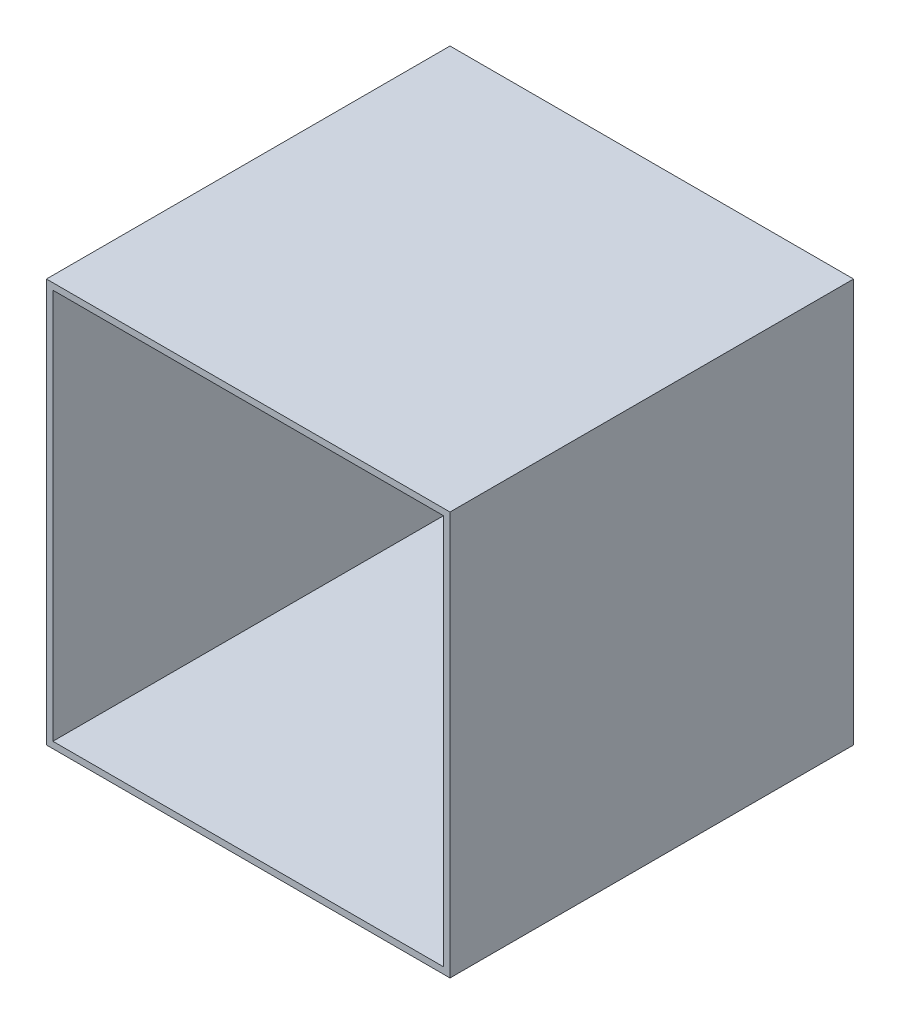
ISO-10303-21;
HEADER;
FILE_DESCRIPTION(('STEP AP214'),'2;1');
FILE_NAME('part.step','',(''),(''),'','','');
FILE_SCHEMA(('AUTOMOTIVE_DESIGN { 1 0 10303 214 1 1 1 1 }'));
ENDSEC;
DATA;
#1=APPLICATION_CONTEXT('core data for automotive mechanical design processes');
#2=APPLICATION_PROTOCOL_DEFINITION('international standard','automotive_design',2000,#1);
#3=PRODUCT_CONTEXT('',#1,'mechanical');
#4=PRODUCT('Part','Part','',(#3));
#5=PRODUCT_RELATED_PRODUCT_CATEGORY('part','',(#4));
#6=PRODUCT_DEFINITION_FORMATION('','',#4);
#7=PRODUCT_DEFINITION_CONTEXT('part definition',#1,'design');
#8=PRODUCT_DEFINITION('design','',#6,#7);
#9=PRODUCT_DEFINITION_SHAPE('','',#8);
#10=(LENGTH_UNIT() NAMED_UNIT(*) SI_UNIT(.MILLI.,.METRE.));
#11=(NAMED_UNIT(*) PLANE_ANGLE_UNIT() SI_UNIT($,.RADIAN.));
#12=(NAMED_UNIT(*) SI_UNIT($,.STERADIAN.) SOLID_ANGLE_UNIT());
#13=UNCERTAINTY_MEASURE_WITH_UNIT(LENGTH_MEASURE(1.E-05),#10,'distance_accuracy_value','');
#14=(GEOMETRIC_REPRESENTATION_CONTEXT(3) GLOBAL_UNCERTAINTY_ASSIGNED_CONTEXT((#13)) GLOBAL_UNIT_ASSIGNED_CONTEXT((#10,
#11,#12)) REPRESENTATION_CONTEXT('',''));
#15=CARTESIAN_POINT('',(0.,0.,0.));
#16=DIRECTION('',(0.,0.,1.));
#17=DIRECTION('',(1.,0.,0.));
#18=AXIS2_PLACEMENT_3D('',#15,#16,#17);
#19=CARTESIAN_POINT('',(0.,0.,25.));
#20=DIRECTION('',(0.,0.,1.));
#21=DIRECTION('',(1.,0.,0.));
#22=AXIS2_PLACEMENT_3D('',#19,#20,#21);
#23=PLANE('',#22);
#24=DIRECTION('',(0.,1.,0.));
#25=VECTOR('',#24,1.);
#26=CARTESIAN_POINT('',(12.5,12.5,25.));
#27=LINE('',#26,#25);
#28=CARTESIAN_POINT('',(12.5,-12.5,25.));
#29=VERTEX_POINT('',#28);
#30=CARTESIAN_POINT('',(12.5,12.5,25.));
#31=VERTEX_POINT('',#30);
#32=EDGE_CURVE('E134',#29,#31,#27,.T.);
#33=ORIENTED_EDGE('',*,*,#32,.T.);
#34=DIRECTION('',(-1.,0.,0.));
#35=VECTOR('',#34,1.);
#36=CARTESIAN_POINT('',(-12.5,12.5,25.));
#37=LINE('',#36,#35);
#38=CARTESIAN_POINT('',(-12.5,12.5,25.));
#39=VERTEX_POINT('',#38);
#40=EDGE_CURVE('E137',#31,#39,#37,.T.);
#41=ORIENTED_EDGE('',*,*,#40,.T.);
#42=DIRECTION('',(0.,-1.,0.));
#43=VECTOR('',#42,1.);
#44=CARTESIAN_POINT('',(-12.5,12.5,25.));
#45=LINE('',#44,#43);
#46=CARTESIAN_POINT('',(-12.5,-12.5,25.));
#47=VERTEX_POINT('',#46);
#48=EDGE_CURVE('E140',#39,#47,#45,.T.);
#49=ORIENTED_EDGE('',*,*,#48,.T.);
#50=DIRECTION('',(1.,0.,0.));
#51=VECTOR('',#50,1.);
#52=CARTESIAN_POINT('',(-12.5,-12.5,25.));
#53=LINE('',#52,#51);
#54=EDGE_CURVE('E142',#47,#29,#53,.T.);
#55=ORIENTED_EDGE('',*,*,#54,.T.);
#56=EDGE_LOOP('',(#33,#41,#49,#55));
#57=FACE_BOUND('',#56,.T.);
#58=DIRECTION('',(-1.,0.,0.));
#59=VECTOR('',#58,1.);
#60=CARTESIAN_POINT('',(-12.1,12.1,25.));
#61=LINE('',#60,#59);
#62=CARTESIAN_POINT('',(12.1,12.1,25.));
#63=VERTEX_POINT('',#62);
#64=CARTESIAN_POINT('',(-12.1,12.1,25.));
#65=VERTEX_POINT('',#64);
#66=EDGE_CURVE('E106',#63,#65,#61,.T.);
#67=ORIENTED_EDGE('',*,*,#66,.F.);
#68=DIRECTION('',(0.,1.,0.));
#69=VECTOR('',#68,1.);
#70=CARTESIAN_POINT('',(12.1,12.1,25.));
#71=LINE('',#70,#69);
#72=CARTESIAN_POINT('',(12.1,-12.1,25.));
#73=VERTEX_POINT('',#72);
#74=EDGE_CURVE('E98',#73,#63,#71,.T.);
#75=ORIENTED_EDGE('',*,*,#74,.F.);
#76=DIRECTION('',(1.,0.,0.));
#77=VECTOR('',#76,1.);
#78=CARTESIAN_POINT('',(-12.1,-12.1,25.));
#79=LINE('',#78,#77);
#80=CARTESIAN_POINT('',(-12.1,-12.1,25.));
#81=VERTEX_POINT('',#80);
#82=EDGE_CURVE('E120',#81,#73,#79,.T.);
#83=ORIENTED_EDGE('',*,*,#82,.F.);
#84=DIRECTION('',(0.,-1.,0.));
#85=VECTOR('',#84,1.);
#86=CARTESIAN_POINT('',(-12.1,12.1,25.));
#87=LINE('',#86,#85);
#88=EDGE_CURVE('E118',#65,#81,#87,.T.);
#89=ORIENTED_EDGE('',*,*,#88,.F.);
#90=EDGE_LOOP('',(#67,#75,#83,#89));
#91=FACE_BOUND('',#90,.T.);
#92=ADVANCED_FACE('F33',(#57,#91),#23,.T.);
#93=CARTESIAN_POINT('',(0.,0.,0.));
#94=DIRECTION('',(0.,0.,1.));
#95=DIRECTION('',(1.,0.,0.));
#96=AXIS2_PLACEMENT_3D('',#93,#94,#95);
#97=PLANE('',#96);
#98=DIRECTION('',(0.,1.,0.));
#99=VECTOR('',#98,1.);
#100=CARTESIAN_POINT('',(12.5,12.5,0.));
#101=LINE('',#100,#99);
#102=CARTESIAN_POINT('',(12.5,-12.5,0.));
#103=VERTEX_POINT('',#102);
#104=CARTESIAN_POINT('',(12.5,12.5,0.));
#105=VERTEX_POINT('',#104);
#106=EDGE_CURVE('E114',#103,#105,#101,.T.);
#107=ORIENTED_EDGE('',*,*,#106,.F.);
#108=DIRECTION('',(1.,0.,0.));
#109=VECTOR('',#108,1.);
#110=CARTESIAN_POINT('',(-12.5,-12.5,0.));
#111=LINE('',#110,#109);
#112=CARTESIAN_POINT('',(-12.5,-12.5,0.));
#113=VERTEX_POINT('',#112);
#114=EDGE_CURVE('E138',#113,#103,#111,.T.);
#115=ORIENTED_EDGE('',*,*,#114,.F.);
#116=DIRECTION('',(0.,-1.,0.));
#117=VECTOR('',#116,1.);
#118=CARTESIAN_POINT('',(-12.5,12.5,0.));
#119=LINE('',#118,#117);
#120=CARTESIAN_POINT('',(-12.5,12.5,0.));
#121=VERTEX_POINT('',#120);
#122=EDGE_CURVE('E149',#121,#113,#119,.T.);
#123=ORIENTED_EDGE('',*,*,#122,.F.);
#124=DIRECTION('',(-1.,0.,0.));
#125=VECTOR('',#124,1.);
#126=CARTESIAN_POINT('',(-12.5,12.5,0.));
#127=LINE('',#126,#125);
#128=EDGE_CURVE('E147',#105,#121,#127,.T.);
#129=ORIENTED_EDGE('',*,*,#128,.F.);
#130=EDGE_LOOP('',(#107,#115,#123,#129));
#131=FACE_BOUND('',#130,.T.);
#132=DIRECTION('',(0.,1.,0.));
#133=VECTOR('',#132,1.);
#134=CARTESIAN_POINT('',(12.1,12.1,0.));
#135=LINE('',#134,#133);
#136=CARTESIAN_POINT('',(12.1,-12.1,0.));
#137=VERTEX_POINT('',#136);
#138=CARTESIAN_POINT('',(12.1,12.1,0.));
#139=VERTEX_POINT('',#138);
#140=EDGE_CURVE('E56',#137,#139,#135,.T.);
#141=ORIENTED_EDGE('',*,*,#140,.T.);
#142=DIRECTION('',(-1.,0.,0.));
#143=VECTOR('',#142,1.);
#144=CARTESIAN_POINT('',(-12.1,12.1,0.));
#145=LINE('',#144,#143);
#146=CARTESIAN_POINT('',(-12.1,12.1,0.));
#147=VERTEX_POINT('',#146);
#148=EDGE_CURVE('E113',#139,#147,#145,.T.);
#149=ORIENTED_EDGE('',*,*,#148,.T.);
#150=DIRECTION('',(0.,-1.,0.));
#151=VECTOR('',#150,1.);
#152=CARTESIAN_POINT('',(-12.1,12.1,0.));
#153=LINE('',#152,#151);
#154=CARTESIAN_POINT('',(-12.1,-12.1,0.));
#155=VERTEX_POINT('',#154);
#156=EDGE_CURVE('E126',#147,#155,#153,.T.);
#157=ORIENTED_EDGE('',*,*,#156,.T.);
#158=DIRECTION('',(1.,0.,0.));
#159=VECTOR('',#158,1.);
#160=CARTESIAN_POINT('',(-12.1,-12.1,0.));
#161=LINE('',#160,#159);
#162=EDGE_CURVE('E107',#155,#137,#161,.T.);
#163=ORIENTED_EDGE('',*,*,#162,.T.);
#164=EDGE_LOOP('',(#141,#149,#157,#163));
#165=FACE_BOUND('',#164,.T.);
#166=ADVANCED_FACE('F167',(#131,#165),#97,.F.);
#167=CARTESIAN_POINT('',(12.5,12.5,25.));
#168=DIRECTION('',(-1.,0.,0.));
#169=DIRECTION('',(0.,-1.,0.));
#170=AXIS2_PLACEMENT_3D('',#167,#168,#169);
#171=PLANE('',#170);
#172=ORIENTED_EDGE('',*,*,#106,.T.);
#173=DIRECTION('',(0.,0.,-1.));
#174=VECTOR('',#173,1.);
#175=CARTESIAN_POINT('',(12.5,12.5,25.));
#176=LINE('',#175,#174);
#177=EDGE_CURVE('E11',#31,#105,#176,.T.);
#178=ORIENTED_EDGE('',*,*,#177,.F.);
#179=ORIENTED_EDGE('',*,*,#32,.F.);
#180=DIRECTION('',(0.,0.,-1.));
#181=VECTOR('',#180,1.);
#182=CARTESIAN_POINT('',(12.5,-12.5,25.));
#183=LINE('',#182,#181);
#184=EDGE_CURVE('E144',#29,#103,#183,.T.);
#185=ORIENTED_EDGE('',*,*,#184,.T.);
#186=EDGE_LOOP('',(#172,#178,#179,#185));
#187=FACE_BOUND('',#186,.T.);
#188=ADVANCED_FACE('F35',(#187),#171,.F.);
#189=CARTESIAN_POINT('',(-12.5,12.5,25.));
#190=DIRECTION('',(0.,-1.,0.));
#191=DIRECTION('',(0.,0.,-1.));
#192=AXIS2_PLACEMENT_3D('',#189,#190,#191);
#193=PLANE('',#192);
#194=ORIENTED_EDGE('',*,*,#128,.T.);
#195=DIRECTION('',(0.,0.,-1.));
#196=VECTOR('',#195,1.);
#197=CARTESIAN_POINT('',(-12.5,12.5,25.));
#198=LINE('',#197,#196);
#199=EDGE_CURVE('E41',#39,#121,#198,.T.);
#200=ORIENTED_EDGE('',*,*,#199,.F.);
#201=ORIENTED_EDGE('',*,*,#40,.F.);
#202=ORIENTED_EDGE('',*,*,#177,.T.);
#203=EDGE_LOOP('',(#194,#200,#201,#202));
#204=FACE_BOUND('',#203,.T.);
#205=ADVANCED_FACE('F177',(#204),#193,.F.);
#206=CARTESIAN_POINT('',(-12.5,12.5,25.));
#207=DIRECTION('',(1.,0.,0.));
#208=DIRECTION('',(0.,1.,0.));
#209=AXIS2_PLACEMENT_3D('',#206,#207,#208);
#210=PLANE('',#209);
#211=ORIENTED_EDGE('',*,*,#122,.T.);
#212=DIRECTION('',(0.,0.,-1.));
#213=VECTOR('',#212,1.);
#214=CARTESIAN_POINT('',(-12.5,-12.5,25.));
#215=LINE('',#214,#213);
#216=EDGE_CURVE('E154',#47,#113,#215,.T.);
#217=ORIENTED_EDGE('',*,*,#216,.F.);
#218=ORIENTED_EDGE('',*,*,#48,.F.);
#219=ORIENTED_EDGE('',*,*,#199,.T.);
#220=EDGE_LOOP('',(#211,#217,#218,#219));
#221=FACE_BOUND('',#220,.T.);
#222=ADVANCED_FACE('F161',(#221),#210,.F.);
#223=CARTESIAN_POINT('',(-12.5,-12.5,25.));
#224=DIRECTION('',(0.,1.,0.));
#225=DIRECTION('',(0.,0.,1.));
#226=AXIS2_PLACEMENT_3D('',#223,#224,#225);
#227=PLANE('',#226);
#228=ORIENTED_EDGE('',*,*,#114,.T.);
#229=ORIENTED_EDGE('',*,*,#184,.F.);
#230=ORIENTED_EDGE('',*,*,#54,.F.);
#231=ORIENTED_EDGE('',*,*,#216,.T.);
#232=EDGE_LOOP('',(#228,#229,#230,#231));
#233=FACE_BOUND('',#232,.T.);
#234=ADVANCED_FACE('F171',(#233),#227,.F.);
#235=CARTESIAN_POINT('',(12.1,12.1,25.));
#236=DIRECTION('',(-1.,0.,0.));
#237=DIRECTION('',(0.,-1.,0.));
#238=AXIS2_PLACEMENT_3D('',#235,#236,#237);
#239=PLANE('',#238);
#240=ORIENTED_EDGE('',*,*,#140,.F.);
#241=DIRECTION('',(0.,0.,-1.));
#242=VECTOR('',#241,1.);
#243=CARTESIAN_POINT('',(12.1,-12.1,25.));
#244=LINE('',#243,#242);
#245=EDGE_CURVE('E102',#73,#137,#244,.T.);
#246=ORIENTED_EDGE('',*,*,#245,.F.);
#247=ORIENTED_EDGE('',*,*,#74,.T.);
#248=DIRECTION('',(0.,0.,-1.));
#249=VECTOR('',#248,1.);
#250=CARTESIAN_POINT('',(12.1,12.1,25.));
#251=LINE('',#250,#249);
#252=EDGE_CURVE('E101',#63,#139,#251,.T.);
#253=ORIENTED_EDGE('',*,*,#252,.T.);
#254=EDGE_LOOP('',(#240,#246,#247,#253));
#255=FACE_BOUND('',#254,.T.);
#256=ADVANCED_FACE('F100',(#255),#239,.T.);
#257=CARTESIAN_POINT('',(-12.1,12.1,25.));
#258=DIRECTION('',(0.,-1.,0.));
#259=DIRECTION('',(0.,0.,-1.));
#260=AXIS2_PLACEMENT_3D('',#257,#258,#259);
#261=PLANE('',#260);
#262=ORIENTED_EDGE('',*,*,#148,.F.);
#263=ORIENTED_EDGE('',*,*,#252,.F.);
#264=ORIENTED_EDGE('',*,*,#66,.T.);
#265=DIRECTION('',(0.,0.,-1.));
#266=VECTOR('',#265,1.);
#267=CARTESIAN_POINT('',(-12.1,12.1,25.));
#268=LINE('',#267,#266);
#269=EDGE_CURVE('E115',#65,#147,#268,.T.);
#270=ORIENTED_EDGE('',*,*,#269,.T.);
#271=EDGE_LOOP('',(#262,#263,#264,#270));
#272=FACE_BOUND('',#271,.T.);
#273=ADVANCED_FACE('F110',(#272),#261,.T.);
#274=CARTESIAN_POINT('',(-12.1,12.1,25.));
#275=DIRECTION('',(1.,0.,0.));
#276=DIRECTION('',(0.,1.,0.));
#277=AXIS2_PLACEMENT_3D('',#274,#275,#276);
#278=PLANE('',#277);
#279=ORIENTED_EDGE('',*,*,#156,.F.);
#280=ORIENTED_EDGE('',*,*,#269,.F.);
#281=ORIENTED_EDGE('',*,*,#88,.T.);
#282=DIRECTION('',(0.,0.,-1.));
#283=VECTOR('',#282,1.);
#284=CARTESIAN_POINT('',(-12.1,-12.1,25.));
#285=LINE('',#284,#283);
#286=EDGE_CURVE('E48',#81,#155,#285,.T.);
#287=ORIENTED_EDGE('',*,*,#286,.T.);
#288=EDGE_LOOP('',(#279,#280,#281,#287));
#289=FACE_BOUND('',#288,.T.);
#290=ADVANCED_FACE('F200',(#289),#278,.T.);
#291=CARTESIAN_POINT('',(-12.1,-12.1,25.));
#292=DIRECTION('',(0.,1.,0.));
#293=DIRECTION('',(0.,0.,1.));
#294=AXIS2_PLACEMENT_3D('',#291,#292,#293);
#295=PLANE('',#294);
#296=ORIENTED_EDGE('',*,*,#162,.F.);
#297=ORIENTED_EDGE('',*,*,#286,.F.);
#298=ORIENTED_EDGE('',*,*,#82,.T.);
#299=ORIENTED_EDGE('',*,*,#245,.T.);
#300=EDGE_LOOP('',(#296,#297,#298,#299));
#301=FACE_BOUND('',#300,.T.);
#302=ADVANCED_FACE('F204',(#301),#295,.T.);
#303=CLOSED_SHELL('',(#92,#166,#188,#205,#222,#234,#256,#273,#290,#302));
#304=MANIFOLD_SOLID_BREP('B2',#303);
#305=ADVANCED_BREP_SHAPE_REPRESENTATION('',(#18,#304),#14);
#306=SHAPE_DEFINITION_REPRESENTATION(#9,#305);
ENDSEC;
END-ISO-10303-21;
